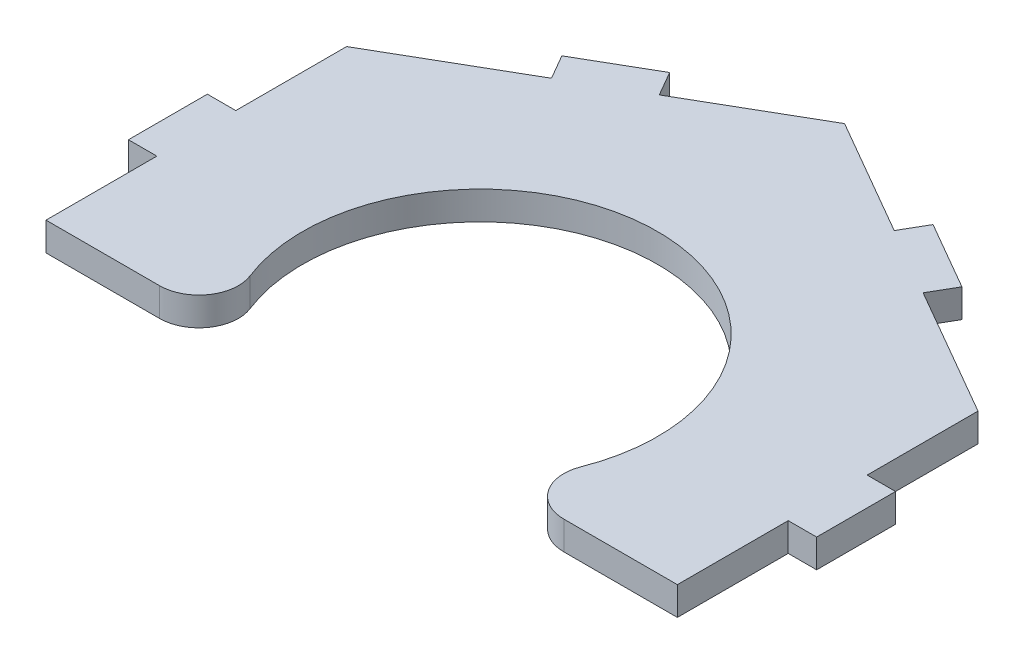
ISO-10303-21;
HEADER;
FILE_DESCRIPTION(('STEP AP214'),'2;1');
FILE_NAME('part.step','',(''),(''),'','','');
FILE_SCHEMA(('AUTOMOTIVE_DESIGN { 1 0 10303 214 1 1 1 1 }'));
ENDSEC;
DATA;
#1=APPLICATION_CONTEXT('core data for automotive mechanical design processes');
#2=APPLICATION_PROTOCOL_DEFINITION('international standard','automotive_design',2000,#1);
#3=PRODUCT_CONTEXT('',#1,'mechanical');
#4=PRODUCT('Part','Part','',(#3));
#5=PRODUCT_RELATED_PRODUCT_CATEGORY('part','',(#4));
#6=PRODUCT_DEFINITION_FORMATION('','',#4);
#7=PRODUCT_DEFINITION_CONTEXT('part definition',#1,'design');
#8=PRODUCT_DEFINITION('design','',#6,#7);
#9=PRODUCT_DEFINITION_SHAPE('','',#8);
#10=(LENGTH_UNIT() NAMED_UNIT(*) SI_UNIT(.MILLI.,.METRE.));
#11=(NAMED_UNIT(*) PLANE_ANGLE_UNIT() SI_UNIT($,.RADIAN.));
#12=(NAMED_UNIT(*) SI_UNIT($,.STERADIAN.) SOLID_ANGLE_UNIT());
#13=UNCERTAINTY_MEASURE_WITH_UNIT(LENGTH_MEASURE(1.E-05),#10,'distance_accuracy_value','');
#14=(GEOMETRIC_REPRESENTATION_CONTEXT(3) GLOBAL_UNCERTAINTY_ASSIGNED_CONTEXT((#13)) GLOBAL_UNIT_ASSIGNED_CONTEXT((#10,
#11,#12)) REPRESENTATION_CONTEXT('',''));
#15=CARTESIAN_POINT('',(0.,0.,0.));
#16=DIRECTION('',(0.,0.,1.));
#17=DIRECTION('',(1.,0.,0.));
#18=AXIS2_PLACEMENT_3D('',#15,#16,#17);
#19=CARTESIAN_POINT('',(50.8,4.572,19.05));
#20=DIRECTION('',(-1.,0.,0.));
#21=DIRECTION('',(0.,0.,1.));
#22=AXIS2_PLACEMENT_3D('',#19,#20,#21);
#23=PLANE('',#22);
#24=DIRECTION('',(0.,1.,0.));
#25=VECTOR('',#24,1.);
#26=CARTESIAN_POINT('',(50.8,0.,-11.4896968374165));
#27=LINE('',#26,#25);
#28=CARTESIAN_POINT('',(50.8,0.,-11.4896968374165));
#29=VERTEX_POINT('',#28);
#30=CARTESIAN_POINT('',(50.8,4.572,-11.4896968374165));
#31=VERTEX_POINT('',#30);
#32=EDGE_CURVE('E214',#29,#31,#27,.T.);
#33=ORIENTED_EDGE('',*,*,#32,.F.);
#34=DIRECTION('',(0.,0.,-1.));
#35=VECTOR('',#34,1.);
#36=CARTESIAN_POINT('',(50.8,0.,19.05));
#37=LINE('',#36,#35);
#38=CARTESIAN_POINT('',(50.8,0.,-29.329393674833));
#39=VERTEX_POINT('',#38);
#40=EDGE_CURVE('E281',#29,#39,#37,.T.);
#41=ORIENTED_EDGE('',*,*,#40,.T.);
#42=DIRECTION('',(0.,-1.,0.));
#43=VECTOR('',#42,1.);
#44=CARTESIAN_POINT('',(50.8,4.572,-29.329393674833));
#45=LINE('',#44,#43);
#46=CARTESIAN_POINT('',(50.8,4.572,-29.329393674833));
#47=VERTEX_POINT('',#46);
#48=EDGE_CURVE('E54',#47,#39,#45,.T.);
#49=ORIENTED_EDGE('',*,*,#48,.F.);
#50=DIRECTION('',(0.,0.,-1.));
#51=VECTOR('',#50,1.);
#52=CARTESIAN_POINT('',(50.8,4.572,19.05));
#53=LINE('',#52,#51);
#54=EDGE_CURVE('E231',#31,#47,#53,.T.);
#55=ORIENTED_EDGE('',*,*,#54,.F.);
#56=EDGE_LOOP('',(#33,#41,#49,#55));
#57=FACE_BOUND('',#56,.T.);
#58=ADVANCED_FACE('F45',(#57),#23,.F.);
#59=CARTESIAN_POINT('',(50.8,4.572,-29.329393674833));
#60=DIRECTION('',(-0.5,0.,0.866025403784439));
#61=DIRECTION('',(0.866025403784439,0.,0.5));
#62=AXIS2_PLACEMENT_3D('',#59,#60,#61);
#63=PLANE('',#62);
#64=DIRECTION('',(-0.866025403784439,0.,-0.5));
#65=VECTOR('',#64,1.);
#66=CARTESIAN_POINT('',(50.8,4.572,-29.329393674833));
#67=LINE('',#66,#65);
#68=CARTESIAN_POINT('',(18.9042843786191,4.572,-47.744393674833));
#69=VERTEX_POINT('',#68);
#70=CARTESIAN_POINT('',(0.,4.572,-58.658787349666));
#71=VERTEX_POINT('',#70);
#72=EDGE_CURVE('E69',#69,#71,#67,.T.);
#73=ORIENTED_EDGE('',*,*,#72,.F.);
#74=DIRECTION('',(0.,1.,0.));
#75=VECTOR('',#74,1.);
#76=CARTESIAN_POINT('',(18.9042843786191,0.,-47.744393674833));
#77=LINE('',#76,#75);
#78=CARTESIAN_POINT('',(18.9042843786191,0.,-47.744393674833));
#79=VERTEX_POINT('',#78);
#80=EDGE_CURVE('E472',#79,#69,#77,.T.);
#81=ORIENTED_EDGE('',*,*,#80,.F.);
#82=DIRECTION('',(-0.866025403784439,0.,-0.5));
#83=VECTOR('',#82,1.);
#84=CARTESIAN_POINT('',(50.8,0.,-29.329393674833));
#85=LINE('',#84,#83);
#86=CARTESIAN_POINT('',(0.,0.,-58.658787349666));
#87=VERTEX_POINT('',#86);
#88=EDGE_CURVE('E287',#79,#87,#85,.T.);
#89=ORIENTED_EDGE('',*,*,#88,.T.);
#90=DIRECTION('',(0.,-1.,0.));
#91=VECTOR('',#90,1.);
#92=CARTESIAN_POINT('',(0.,4.572,-58.658787349666));
#93=LINE('',#92,#91);
#94=EDGE_CURVE('E334',#71,#87,#93,.T.);
#95=ORIENTED_EDGE('',*,*,#94,.F.);
#96=EDGE_LOOP('',(#73,#81,#89,#95));
#97=FACE_BOUND('',#96,.T.);
#98=ADVANCED_FACE('F470',(#97),#63,.F.);
#99=CARTESIAN_POINT('',(0.,4.572,-58.658787349666));
#100=DIRECTION('',(0.5,0.,0.866025403784439));
#101=DIRECTION('',(0.866025403784439,0.,-0.5));
#102=AXIS2_PLACEMENT_3D('',#99,#100,#101);
#103=PLANE('',#102);
#104=DIRECTION('',(-0.866025403784439,0.,0.5));
#105=VECTOR('',#104,1.);
#106=CARTESIAN_POINT('',(0.,4.572,-58.658787349666));
#107=LINE('',#106,#105);
#108=CARTESIAN_POINT('',(-29.9028070066815,4.572,-41.394393674833));
#109=VERTEX_POINT('',#108);
#110=CARTESIAN_POINT('',(-50.8,4.572,-29.329393674833));
#111=VERTEX_POINT('',#110);
#112=EDGE_CURVE('E254',#109,#111,#107,.T.);
#113=ORIENTED_EDGE('',*,*,#112,.F.);
#114=DIRECTION('',(0.,1.,0.));
#115=VECTOR('',#114,1.);
#116=CARTESIAN_POINT('',(-29.9028070066815,0.,-41.394393674833));
#117=LINE('',#116,#115);
#118=CARTESIAN_POINT('',(-29.9028070066815,0.,-41.394393674833));
#119=VERTEX_POINT('',#118);
#120=EDGE_CURVE('E375',#119,#109,#117,.T.);
#121=ORIENTED_EDGE('',*,*,#120,.F.);
#122=DIRECTION('',(-0.866025403784439,0.,0.5));
#123=VECTOR('',#122,1.);
#124=CARTESIAN_POINT('',(0.,0.,-58.658787349666));
#125=LINE('',#124,#123);
#126=CARTESIAN_POINT('',(-50.8,0.,-29.329393674833));
#127=VERTEX_POINT('',#126);
#128=EDGE_CURVE('E291',#119,#127,#125,.T.);
#129=ORIENTED_EDGE('',*,*,#128,.T.);
#130=DIRECTION('',(0.,-1.,0.));
#131=VECTOR('',#130,1.);
#132=CARTESIAN_POINT('',(-50.8,4.572,-29.329393674833));
#133=LINE('',#132,#131);
#134=EDGE_CURVE('E330',#111,#127,#133,.T.);
#135=ORIENTED_EDGE('',*,*,#134,.F.);
#136=EDGE_LOOP('',(#113,#121,#129,#135));
#137=FACE_BOUND('',#136,.T.);
#138=ADVANCED_FACE('F447',(#137),#103,.F.);
#139=CARTESIAN_POINT('',(-50.8,4.572,-29.329393674833));
#140=DIRECTION('',(1.,0.,0.));
#141=DIRECTION('',(0.,0.,-1.));
#142=AXIS2_PLACEMENT_3D('',#139,#140,#141);
#143=PLANE('',#142);
#144=DIRECTION('',(0.,1.,0.));
#145=VECTOR('',#144,1.);
#146=CARTESIAN_POINT('',(-50.8,0.,1.21030316258351));
#147=LINE('',#146,#145);
#148=CARTESIAN_POINT('',(-50.8,0.,1.21030316258351));
#149=VERTEX_POINT('',#148);
#150=CARTESIAN_POINT('',(-50.8,4.572,1.21030316258351));
#151=VERTEX_POINT('',#150);
#152=EDGE_CURVE('E282',#149,#151,#147,.T.);
#153=ORIENTED_EDGE('',*,*,#152,.F.);
#154=DIRECTION('',(0.,0.,1.));
#155=VECTOR('',#154,1.);
#156=CARTESIAN_POINT('',(-50.8,0.,-29.329393674833));
#157=LINE('',#156,#155);
#158=CARTESIAN_POINT('',(-50.8,0.,19.05));
#159=VERTEX_POINT('',#158);
#160=EDGE_CURVE('E295',#149,#159,#157,.T.);
#161=ORIENTED_EDGE('',*,*,#160,.T.);
#162=DIRECTION('',(0.,-1.,0.));
#163=VECTOR('',#162,1.);
#164=CARTESIAN_POINT('',(-50.8,4.572,19.05));
#165=LINE('',#164,#163);
#166=CARTESIAN_POINT('',(-50.8,4.572,19.05));
#167=VERTEX_POINT('',#166);
#168=EDGE_CURVE('E326',#167,#159,#165,.T.);
#169=ORIENTED_EDGE('',*,*,#168,.F.);
#170=DIRECTION('',(0.,0.,1.));
#171=VECTOR('',#170,1.);
#172=CARTESIAN_POINT('',(-50.8,4.572,-29.329393674833));
#173=LINE('',#172,#171);
#174=EDGE_CURVE('E259',#151,#167,#173,.T.);
#175=ORIENTED_EDGE('',*,*,#174,.F.);
#176=EDGE_LOOP('',(#153,#161,#169,#175));
#177=FACE_BOUND('',#176,.T.);
#178=ADVANCED_FACE('F462',(#177),#143,.F.);
#179=CARTESIAN_POINT('',(50.8,4.572,19.05));
#180=DIRECTION('',(0.,0.,-1.));
#181=DIRECTION('',(-1.,0.,0.));
#182=AXIS2_PLACEMENT_3D('',#179,#180,#181);
#183=PLANE('',#182);
#184=DIRECTION('',(1.,0.,0.));
#185=VECTOR('',#184,1.);
#186=CARTESIAN_POINT('',(50.8,0.,19.05));
#187=LINE('',#186,#185);
#188=CARTESIAN_POINT('',(32.5340686819217,0.,19.05));
#189=VERTEX_POINT('',#188);
#190=CARTESIAN_POINT('',(50.8,0.,19.05));
#191=VERTEX_POINT('',#190);
#192=EDGE_CURVE('E277',#189,#191,#187,.T.);
#193=ORIENTED_EDGE('',*,*,#192,.T.);
#194=DIRECTION('',(0.,-1.,0.));
#195=VECTOR('',#194,1.);
#196=CARTESIAN_POINT('',(50.8,4.572,19.05));
#197=LINE('',#196,#195);
#198=CARTESIAN_POINT('',(50.8,4.572,19.05));
#199=VERTEX_POINT('',#198);
#200=EDGE_CURVE('E11',#199,#191,#197,.T.);
#201=ORIENTED_EDGE('',*,*,#200,.F.);
#202=DIRECTION('',(1.,0.,0.));
#203=VECTOR('',#202,1.);
#204=CARTESIAN_POINT('',(50.8,4.572,19.05));
#205=LINE('',#204,#203);
#206=CARTESIAN_POINT('',(32.5340686819217,4.572,19.05));
#207=VERTEX_POINT('',#206);
#208=EDGE_CURVE('E242',#207,#199,#205,.T.);
#209=ORIENTED_EDGE('',*,*,#208,.F.);
#210=DIRECTION('',(0.,-1.,0.));
#211=VECTOR('',#210,1.);
#212=CARTESIAN_POINT('',(32.5340686819217,4.572,19.05));
#213=LINE('',#212,#211);
#214=EDGE_CURVE('E276',#207,#189,#213,.T.);
#215=ORIENTED_EDGE('',*,*,#214,.T.);
#216=EDGE_LOOP('',(#193,#201,#209,#215));
#217=FACE_BOUND('',#216,.T.);
#218=ADVANCED_FACE('F47',(#217),#183,.F.);
#219=CARTESIAN_POINT('',(50.8,0.,1.21030316258351));
#220=VERTEX_POINT('',#219);
#221=EDGE_CURVE('E283',#191,#220,#37,.T.);
#222=ORIENTED_EDGE('',*,*,#221,.T.);
#223=DIRECTION('',(0.,1.,0.));
#224=VECTOR('',#223,1.);
#225=CARTESIAN_POINT('',(50.8,0.,1.21030316258351));
#226=LINE('',#225,#224);
#227=CARTESIAN_POINT('',(50.8,4.572,1.21030316258351));
#228=VERTEX_POINT('',#227);
#229=EDGE_CURVE('E511',#220,#228,#226,.T.);
#230=ORIENTED_EDGE('',*,*,#229,.T.);
#231=EDGE_CURVE('E241',#199,#228,#53,.T.);
#232=ORIENTED_EDGE('',*,*,#231,.F.);
#233=ORIENTED_EDGE('',*,*,#200,.T.);
#234=EDGE_LOOP('',(#222,#230,#232,#233));
#235=FACE_BOUND('',#234,.T.);
#236=ADVANCED_FACE('F510',(#235),#23,.F.);
#237=CARTESIAN_POINT('',(29.9028070066815,0.,-41.394393674833));
#238=VERTEX_POINT('',#237);
#239=EDGE_CURVE('E288',#39,#238,#85,.T.);
#240=ORIENTED_EDGE('',*,*,#239,.T.);
#241=DIRECTION('',(0.,1.,0.));
#242=VECTOR('',#241,1.);
#243=CARTESIAN_POINT('',(29.9028070066815,0.,-41.394393674833));
#244=LINE('',#243,#242);
#245=CARTESIAN_POINT('',(29.9028070066815,4.572,-41.394393674833));
#246=VERTEX_POINT('',#245);
#247=EDGE_CURVE('E534',#238,#246,#244,.T.);
#248=ORIENTED_EDGE('',*,*,#247,.T.);
#249=EDGE_CURVE('E251',#47,#246,#67,.T.);
#250=ORIENTED_EDGE('',*,*,#249,.F.);
#251=ORIENTED_EDGE('',*,*,#48,.T.);
#252=EDGE_LOOP('',(#240,#248,#250,#251));
#253=FACE_BOUND('',#252,.T.);
#254=ADVANCED_FACE('F340',(#253),#63,.F.);
#255=CARTESIAN_POINT('',(-18.9042843786191,0.,-47.744393674833));
#256=VERTEX_POINT('',#255);
#257=EDGE_CURVE('E292',#87,#256,#125,.T.);
#258=ORIENTED_EDGE('',*,*,#257,.T.);
#259=DIRECTION('',(0.,1.,0.));
#260=VECTOR('',#259,1.);
#261=CARTESIAN_POINT('',(-18.9042843786191,0.,-47.744393674833));
#262=LINE('',#261,#260);
#263=CARTESIAN_POINT('',(-18.9042843786191,4.572,-47.744393674833));
#264=VERTEX_POINT('',#263);
#265=EDGE_CURVE('E365',#256,#264,#262,.T.);
#266=ORIENTED_EDGE('',*,*,#265,.T.);
#267=EDGE_CURVE('E255',#71,#264,#107,.T.);
#268=ORIENTED_EDGE('',*,*,#267,.F.);
#269=ORIENTED_EDGE('',*,*,#94,.T.);
#270=EDGE_LOOP('',(#258,#266,#268,#269));
#271=FACE_BOUND('',#270,.T.);
#272=ADVANCED_FACE('F476',(#271),#103,.F.);
#273=CARTESIAN_POINT('',(-50.8,0.,-11.4896968374165));
#274=VERTEX_POINT('',#273);
#275=EDGE_CURVE('E296',#127,#274,#157,.T.);
#276=ORIENTED_EDGE('',*,*,#275,.T.);
#277=DIRECTION('',(0.,1.,0.));
#278=VECTOR('',#277,1.);
#279=CARTESIAN_POINT('',(-50.8,0.,-11.4896968374165));
#280=LINE('',#279,#278);
#281=CARTESIAN_POINT('',(-50.8,4.572,-11.4896968374165));
#282=VERTEX_POINT('',#281);
#283=EDGE_CURVE('E416',#274,#282,#280,.T.);
#284=ORIENTED_EDGE('',*,*,#283,.T.);
#285=EDGE_CURVE('E260',#111,#282,#173,.T.);
#286=ORIENTED_EDGE('',*,*,#285,.F.);
#287=ORIENTED_EDGE('',*,*,#134,.T.);
#288=EDGE_LOOP('',(#276,#284,#286,#287));
#289=FACE_BOUND('',#288,.T.);
#290=ADVANCED_FACE('F438',(#289),#143,.F.);
#291=CARTESIAN_POINT('',(-50.8,4.572,19.05));
#292=DIRECTION('',(0.,0.,-1.));
#293=DIRECTION('',(-1.,0.,0.));
#294=AXIS2_PLACEMENT_3D('',#291,#292,#293);
#295=PLANE('',#294);
#296=DIRECTION('',(1.,0.,0.));
#297=VECTOR('',#296,1.);
#298=CARTESIAN_POINT('',(-50.8,0.,19.05));
#299=LINE('',#298,#297);
#300=CARTESIAN_POINT('',(-32.5340686819217,0.,19.05));
#301=VERTEX_POINT('',#300);
#302=EDGE_CURVE('E300',#159,#301,#299,.T.);
#303=ORIENTED_EDGE('',*,*,#302,.T.);
#304=DIRECTION('',(0.,-1.,0.));
#305=VECTOR('',#304,1.);
#306=CARTESIAN_POINT('',(-32.5340686819217,4.572,19.05));
#307=LINE('',#306,#305);
#308=CARTESIAN_POINT('',(-32.5340686819217,4.572,19.05));
#309=VERTEX_POINT('',#308);
#310=EDGE_CURVE('E322',#309,#301,#307,.T.);
#311=ORIENTED_EDGE('',*,*,#310,.F.);
#312=DIRECTION('',(1.,0.,0.));
#313=VECTOR('',#312,1.);
#314=CARTESIAN_POINT('',(-50.8,4.572,19.05));
#315=LINE('',#314,#313);
#316=EDGE_CURVE('E264',#167,#309,#315,.T.);
#317=ORIENTED_EDGE('',*,*,#316,.F.);
#318=ORIENTED_EDGE('',*,*,#168,.T.);
#319=EDGE_LOOP('',(#303,#311,#317,#318));
#320=FACE_BOUND('',#319,.T.);
#321=ADVANCED_FACE('F491',(#320),#295,.F.);
#322=CARTESIAN_POINT('',(-32.5340686819217,4.572,12.7));
#323=DIRECTION('',(0.,-1.,0.));
#324=DIRECTION('',(0.,0.,-1.));
#325=AXIS2_PLACEMENT_3D('',#322,#323,#324);
#326=CYLINDRICAL_SURFACE('',#325,6.35);
#327=CARTESIAN_POINT('',(-32.5340686819217,0.,12.7));
#328=DIRECTION('',(0.,1.,0.));
#329=DIRECTION('',(0.,0.,1.));
#330=AXIS2_PLACEMENT_3D('',#327,#328,#329);
#331=CIRCLE('',#330,6.35);
#332=CARTESIAN_POINT('',(-26.6187834670269,0.,10.3909090909091));
#333=VERTEX_POINT('',#332);
#334=EDGE_CURVE('E303',#301,#333,#331,.T.);
#335=ORIENTED_EDGE('',*,*,#334,.T.);
#336=DIRECTION('',(0.,-1.,0.));
#337=VECTOR('',#336,1.);
#338=CARTESIAN_POINT('',(-26.6187834670269,4.572,10.3909090909091));
#339=LINE('',#338,#337);
#340=CARTESIAN_POINT('',(-26.6187834670269,4.572,10.3909090909091));
#341=VERTEX_POINT('',#340);
#342=EDGE_CURVE('E318',#341,#333,#339,.T.);
#343=ORIENTED_EDGE('',*,*,#342,.F.);
#344=CARTESIAN_POINT('',(-32.5340686819217,4.572,12.7));
#345=DIRECTION('',(0.,1.,0.));
#346=DIRECTION('',(0.,0.,1.));
#347=AXIS2_PLACEMENT_3D('',#344,#345,#346);
#348=CIRCLE('',#347,6.35);
#349=EDGE_CURVE('E267',#309,#341,#348,.T.);
#350=ORIENTED_EDGE('',*,*,#349,.F.);
#351=ORIENTED_EDGE('',*,*,#310,.T.);
#352=EDGE_LOOP('',(#335,#343,#350,#351));
#353=FACE_BOUND('',#352,.T.);
#354=ADVANCED_FACE('F495',(#353),#326,.T.);
#355=CARTESIAN_POINT('',(0.,4.572,0.));
#356=DIRECTION('',(0.,-1.,0.));
#357=DIRECTION('',(0.,0.,-1.));
#358=AXIS2_PLACEMENT_3D('',#355,#356,#357);
#359=CYLINDRICAL_SURFACE('',#358,28.575);
#360=CARTESIAN_POINT('',(0.,0.,0.));
#361=DIRECTION('',(0.,-1.,0.));
#362=DIRECTION('',(0.,0.,1.));
#363=AXIS2_PLACEMENT_3D('',#360,#361,#362);
#364=CIRCLE('',#363,28.575);
#365=CARTESIAN_POINT('',(26.6187834670269,0.,10.3909090909091));
#366=VERTEX_POINT('',#365);
#367=EDGE_CURVE('E306',#333,#366,#364,.T.);
#368=ORIENTED_EDGE('',*,*,#367,.T.);
#369=DIRECTION('',(0.,-1.,0.));
#370=VECTOR('',#369,1.);
#371=CARTESIAN_POINT('',(26.6187834670269,4.572,10.3909090909091));
#372=LINE('',#371,#370);
#373=CARTESIAN_POINT('',(26.6187834670269,4.572,10.3909090909091));
#374=VERTEX_POINT('',#373);
#375=EDGE_CURVE('E314',#374,#366,#372,.T.);
#376=ORIENTED_EDGE('',*,*,#375,.F.);
#377=CARTESIAN_POINT('',(0.,4.572,0.));
#378=DIRECTION('',(0.,-1.,0.));
#379=DIRECTION('',(0.,0.,1.));
#380=AXIS2_PLACEMENT_3D('',#377,#378,#379);
#381=CIRCLE('',#380,28.575);
#382=EDGE_CURVE('E270',#341,#374,#381,.T.);
#383=ORIENTED_EDGE('',*,*,#382,.F.);
#384=ORIENTED_EDGE('',*,*,#342,.T.);
#385=EDGE_LOOP('',(#368,#376,#383,#384));
#386=FACE_BOUND('',#385,.T.);
#387=ADVANCED_FACE('F501',(#386),#359,.F.);
#388=CARTESIAN_POINT('',(32.5340686819217,4.572,12.7));
#389=DIRECTION('',(0.,-1.,0.));
#390=DIRECTION('',(0.,0.,-1.));
#391=AXIS2_PLACEMENT_3D('',#388,#389,#390);
#392=CYLINDRICAL_SURFACE('',#391,6.35);
#393=CARTESIAN_POINT('',(32.5340686819217,0.,12.7));
#394=DIRECTION('',(0.,1.,0.));
#395=DIRECTION('',(0.,0.,-1.));
#396=AXIS2_PLACEMENT_3D('',#393,#394,#395);
#397=CIRCLE('',#396,6.35);
#398=EDGE_CURVE('E247',#366,#189,#397,.T.);
#399=ORIENTED_EDGE('',*,*,#398,.T.);
#400=ORIENTED_EDGE('',*,*,#214,.F.);
#401=CARTESIAN_POINT('',(32.5340686819217,4.572,12.7));
#402=DIRECTION('',(0.,1.,0.));
#403=DIRECTION('',(0.,0.,-1.));
#404=AXIS2_PLACEMENT_3D('',#401,#402,#403);
#405=CIRCLE('',#404,6.35);
#406=EDGE_CURVE('E273',#374,#207,#405,.T.);
#407=ORIENTED_EDGE('',*,*,#406,.F.);
#408=ORIENTED_EDGE('',*,*,#375,.T.);
#409=EDGE_LOOP('',(#399,#400,#407,#408));
#410=FACE_BOUND('',#409,.T.);
#411=ADVANCED_FACE('F505',(#410),#392,.T.);
#412=CARTESIAN_POINT('',(32.5340686819217,4.572,12.7));
#413=DIRECTION('',(0.,-1.,0.));
#414=DIRECTION('',(0.,0.,-1.));
#415=AXIS2_PLACEMENT_3D('',#412,#413,#414);
#416=PLANE('',#415);
#417=ORIENTED_EDGE('',*,*,#208,.T.);
#418=ORIENTED_EDGE('',*,*,#231,.T.);
#419=DIRECTION('',(1.,0.,0.));
#420=VECTOR('',#419,1.);
#421=CARTESIAN_POINT('',(55.372,4.572,1.21030316258351));
#422=LINE('',#421,#420);
#423=CARTESIAN_POINT('',(55.372,4.572,1.21030316258351));
#424=VERTEX_POINT('',#423);
#425=EDGE_CURVE('E61',#228,#424,#422,.T.);
#426=ORIENTED_EDGE('',*,*,#425,.T.);
#427=DIRECTION('',(0.,0.,-1.));
#428=VECTOR('',#427,1.);
#429=CARTESIAN_POINT('',(55.372,4.572,-11.4896968374165));
#430=LINE('',#429,#428);
#431=CARTESIAN_POINT('',(55.372,4.572,-11.4896968374165));
#432=VERTEX_POINT('',#431);
#433=EDGE_CURVE('E234',#424,#432,#430,.T.);
#434=ORIENTED_EDGE('',*,*,#433,.T.);
#435=DIRECTION('',(-1.,0.,0.));
#436=VECTOR('',#435,1.);
#437=CARTESIAN_POINT('',(50.8,4.572,-11.4896968374165));
#438=LINE('',#437,#436);
#439=EDGE_CURVE('E217',#432,#31,#438,.T.);
#440=ORIENTED_EDGE('',*,*,#439,.T.);
#441=ORIENTED_EDGE('',*,*,#54,.T.);
#442=ORIENTED_EDGE('',*,*,#249,.T.);
#443=DIRECTION('',(0.500000000000002,0.,-0.866025403784438));
#444=VECTOR('',#443,1.);
#445=CARTESIAN_POINT('',(32.1888070066815,4.572,-45.3538618209354));
#446=LINE('',#445,#444);
#447=CARTESIAN_POINT('',(32.1888070066815,4.572,-45.3538618209354));
#448=VERTEX_POINT('',#447);
#449=EDGE_CURVE('E379',#246,#448,#446,.T.);
#450=ORIENTED_EDGE('',*,*,#449,.T.);
#451=DIRECTION('',(-0.866025403784438,0.,-0.5));
#452=VECTOR('',#451,1.);
#453=CARTESIAN_POINT('',(21.1902843786191,4.572,-51.7038618209354));
#454=LINE('',#453,#452);
#455=CARTESIAN_POINT('',(21.1902843786191,4.572,-51.7038618209354));
#456=VERTEX_POINT('',#455);
#457=EDGE_CURVE('E359',#448,#456,#454,.T.);
#458=ORIENTED_EDGE('',*,*,#457,.T.);
#459=DIRECTION('',(-0.5,0.,0.866025403784438));
#460=VECTOR('',#459,1.);
#461=CARTESIAN_POINT('',(18.9042843786191,4.572,-47.744393674833));
#462=LINE('',#461,#460);
#463=EDGE_CURVE('E354',#456,#69,#462,.T.);
#464=ORIENTED_EDGE('',*,*,#463,.T.);
#465=ORIENTED_EDGE('',*,*,#72,.T.);
#466=ORIENTED_EDGE('',*,*,#267,.T.);
#467=DIRECTION('',(-0.5,0.,-0.866025403784438));
#468=VECTOR('',#467,1.);
#469=CARTESIAN_POINT('',(-21.1902843786191,4.572,-51.7038618209354));
#470=LINE('',#469,#468);
#471=CARTESIAN_POINT('',(-21.1902843786191,4.572,-51.7038618209354));
#472=VERTEX_POINT('',#471);
#473=EDGE_CURVE('E389',#264,#472,#470,.T.);
#474=ORIENTED_EDGE('',*,*,#473,.T.);
#475=DIRECTION('',(-0.866025403784439,0.,0.5));
#476=VECTOR('',#475,1.);
#477=CARTESIAN_POINT('',(-32.1888070066815,4.572,-45.3538618209354));
#478=LINE('',#477,#476);
#479=CARTESIAN_POINT('',(-32.1888070066815,4.572,-45.3538618209354));
#480=VERTEX_POINT('',#479);
#481=EDGE_CURVE('E384',#472,#480,#478,.T.);
#482=ORIENTED_EDGE('',*,*,#481,.T.);
#483=DIRECTION('',(0.5,0.,0.866025403784438));
#484=VECTOR('',#483,1.);
#485=CARTESIAN_POINT('',(-29.9028070066815,4.572,-41.394393674833));
#486=LINE('',#485,#484);
#487=EDGE_CURVE('E380',#480,#109,#486,.T.);
#488=ORIENTED_EDGE('',*,*,#487,.T.);
#489=ORIENTED_EDGE('',*,*,#112,.T.);
#490=ORIENTED_EDGE('',*,*,#285,.T.);
#491=DIRECTION('',(-1.,0.,0.));
#492=VECTOR('',#491,1.);
#493=CARTESIAN_POINT('',(-50.8,4.572,-11.4896968374165));
#494=LINE('',#493,#492);
#495=CARTESIAN_POINT('',(-55.372,4.572,-11.4896968374165));
#496=VERTEX_POINT('',#495);
#497=EDGE_CURVE('E393',#282,#496,#494,.T.);
#498=ORIENTED_EDGE('',*,*,#497,.T.);
#499=DIRECTION('',(0.,0.,1.));
#500=VECTOR('',#499,1.);
#501=CARTESIAN_POINT('',(-55.372,4.572,-11.4896968374165));
#502=LINE('',#501,#500);
#503=CARTESIAN_POINT('',(-55.372,4.572,1.21030316258352));
#504=VERTEX_POINT('',#503);
#505=EDGE_CURVE('E420',#496,#504,#502,.T.);
#506=ORIENTED_EDGE('',*,*,#505,.T.);
#507=DIRECTION('',(1.,0.,0.));
#508=VECTOR('',#507,1.);
#509=CARTESIAN_POINT('',(-55.372,4.572,1.21030316258352));
#510=LINE('',#509,#508);
#511=EDGE_CURVE('E409',#504,#151,#510,.T.);
#512=ORIENTED_EDGE('',*,*,#511,.T.);
#513=ORIENTED_EDGE('',*,*,#174,.T.);
#514=ORIENTED_EDGE('',*,*,#316,.T.);
#515=ORIENTED_EDGE('',*,*,#349,.T.);
#516=ORIENTED_EDGE('',*,*,#382,.T.);
#517=ORIENTED_EDGE('',*,*,#406,.T.);
#518=EDGE_LOOP('',(#417,#418,#426,#434,#440,#441,#442,#450,#458,#464,#465,#466,#474,#482,#488,
#489,#490,#498,#506,#512,#513,#514,#515,#516,#517));
#519=FACE_BOUND('',#518,.T.);
#520=ADVANCED_FACE('F229',(#519),#416,.F.);
#521=CARTESIAN_POINT('',(32.5340686819217,0.,12.7));
#522=DIRECTION('',(0.,-1.,0.));
#523=DIRECTION('',(0.,0.,-1.));
#524=AXIS2_PLACEMENT_3D('',#521,#522,#523);
#525=PLANE('',#524);
#526=ORIENTED_EDGE('',*,*,#192,.F.);
#527=ORIENTED_EDGE('',*,*,#398,.F.);
#528=ORIENTED_EDGE('',*,*,#367,.F.);
#529=ORIENTED_EDGE('',*,*,#334,.F.);
#530=ORIENTED_EDGE('',*,*,#302,.F.);
#531=ORIENTED_EDGE('',*,*,#160,.F.);
#532=DIRECTION('',(1.,0.,0.));
#533=VECTOR('',#532,1.);
#534=CARTESIAN_POINT('',(-55.372,0.,1.21030316258352));
#535=LINE('',#534,#533);
#536=CARTESIAN_POINT('',(-55.372,0.,1.21030316258352));
#537=VERTEX_POINT('',#536);
#538=EDGE_CURVE('E413',#537,#149,#535,.T.);
#539=ORIENTED_EDGE('',*,*,#538,.F.);
#540=DIRECTION('',(0.,0.,1.));
#541=VECTOR('',#540,1.);
#542=CARTESIAN_POINT('',(-55.372,0.,-11.4896968374165));
#543=LINE('',#542,#541);
#544=CARTESIAN_POINT('',(-55.372,0.,-11.4896968374165));
#545=VERTEX_POINT('',#544);
#546=EDGE_CURVE('E408',#545,#537,#543,.T.);
#547=ORIENTED_EDGE('',*,*,#546,.F.);
#548=DIRECTION('',(-1.,0.,0.));
#549=VECTOR('',#548,1.);
#550=CARTESIAN_POINT('',(-50.8,0.,-11.4896968374165));
#551=LINE('',#550,#549);
#552=EDGE_CURVE('E404',#274,#545,#551,.T.);
#553=ORIENTED_EDGE('',*,*,#552,.F.);
#554=ORIENTED_EDGE('',*,*,#275,.F.);
#555=ORIENTED_EDGE('',*,*,#128,.F.);
#556=DIRECTION('',(0.5,0.,0.866025403784438));
#557=VECTOR('',#556,1.);
#558=CARTESIAN_POINT('',(-29.9028070066815,0.,-41.394393674833));
#559=LINE('',#558,#557);
#560=CARTESIAN_POINT('',(-32.1888070066815,0.,-45.3538618209354));
#561=VERTEX_POINT('',#560);
#562=EDGE_CURVE('E368',#561,#119,#559,.T.);
#563=ORIENTED_EDGE('',*,*,#562,.F.);
#564=DIRECTION('',(-0.866025403784439,0.,0.5));
#565=VECTOR('',#564,1.);
#566=CARTESIAN_POINT('',(-32.1888070066815,0.,-45.3538618209354));
#567=LINE('',#566,#565);
#568=CARTESIAN_POINT('',(-21.1902843786191,0.,-51.7038618209354));
#569=VERTEX_POINT('',#568);
#570=EDGE_CURVE('E397',#569,#561,#567,.T.);
#571=ORIENTED_EDGE('',*,*,#570,.F.);
#572=DIRECTION('',(-0.5,0.,-0.866025403784438));
#573=VECTOR('',#572,1.);
#574=CARTESIAN_POINT('',(-21.1902843786191,0.,-51.7038618209354));
#575=LINE('',#574,#573);
#576=EDGE_CURVE('E385',#256,#569,#575,.T.);
#577=ORIENTED_EDGE('',*,*,#576,.F.);
#578=ORIENTED_EDGE('',*,*,#257,.F.);
#579=ORIENTED_EDGE('',*,*,#88,.F.);
#580=DIRECTION('',(-0.5,0.,0.866025403784438));
#581=VECTOR('',#580,1.);
#582=CARTESIAN_POINT('',(18.9042843786191,0.,-47.744393674833));
#583=LINE('',#582,#581);
#584=CARTESIAN_POINT('',(21.1902843786191,0.,-51.7038618209354));
#585=VERTEX_POINT('',#584);
#586=EDGE_CURVE('E361',#585,#79,#583,.T.);
#587=ORIENTED_EDGE('',*,*,#586,.F.);
#588=DIRECTION('',(-0.866025403784438,0.,-0.5));
#589=VECTOR('',#588,1.);
#590=CARTESIAN_POINT('',(21.1902843786191,0.,-51.7038618209354));
#591=LINE('',#590,#589);
#592=CARTESIAN_POINT('',(32.1888070066815,0.,-45.3538618209354));
#593=VERTEX_POINT('',#592);
#594=EDGE_CURVE('E351',#593,#585,#591,.T.);
#595=ORIENTED_EDGE('',*,*,#594,.F.);
#596=DIRECTION('',(0.500000000000002,0.,-0.866025403784438));
#597=VECTOR('',#596,1.);
#598=CARTESIAN_POINT('',(32.1888070066815,0.,-45.3538618209354));
#599=LINE('',#598,#597);
#600=EDGE_CURVE('E348',#238,#593,#599,.T.);
#601=ORIENTED_EDGE('',*,*,#600,.F.);
#602=ORIENTED_EDGE('',*,*,#239,.F.);
#603=ORIENTED_EDGE('',*,*,#40,.F.);
#604=DIRECTION('',(-1.,0.,0.));
#605=VECTOR('',#604,1.);
#606=CARTESIAN_POINT('',(50.8,0.,-11.4896968374165));
#607=LINE('',#606,#605);
#608=CARTESIAN_POINT('',(55.372,0.,-11.4896968374165));
#609=VERTEX_POINT('',#608);
#610=EDGE_CURVE('E219',#609,#29,#607,.T.);
#611=ORIENTED_EDGE('',*,*,#610,.F.);
#612=DIRECTION('',(0.,0.,-1.));
#613=VECTOR('',#612,1.);
#614=CARTESIAN_POINT('',(55.372,0.,-11.4896968374165));
#615=LINE('',#614,#613);
#616=CARTESIAN_POINT('',(55.372,0.,1.21030316258351));
#617=VERTEX_POINT('',#616);
#618=EDGE_CURVE('E519',#617,#609,#615,.T.);
#619=ORIENTED_EDGE('',*,*,#618,.F.);
#620=DIRECTION('',(1.,0.,0.));
#621=VECTOR('',#620,1.);
#622=CARTESIAN_POINT('',(55.372,0.,1.21030316258351));
#623=LINE('',#622,#621);
#624=EDGE_CURVE('E236',#220,#617,#623,.T.);
#625=ORIENTED_EDGE('',*,*,#624,.F.);
#626=ORIENTED_EDGE('',*,*,#221,.F.);
#627=EDGE_LOOP('',(#526,#527,#528,#529,#530,#531,#539,#547,#553,#554,#555,#563,#571,#577,#578,
#579,#587,#595,#601,#602,#603,#611,#619,#625,#626));
#628=FACE_BOUND('',#627,.T.);
#629=ADVANCED_FACE('F345',(#628),#525,.T.);
#630=CARTESIAN_POINT('',(-55.372,0.,1.21030316258352));
#631=DIRECTION('',(0.,0.,1.));
#632=DIRECTION('',(1.,0.,0.));
#633=AXIS2_PLACEMENT_3D('',#630,#631,#632);
#634=PLANE('',#633);
#635=ORIENTED_EDGE('',*,*,#511,.F.);
#636=DIRECTION('',(0.,1.,0.));
#637=VECTOR('',#636,1.);
#638=CARTESIAN_POINT('',(-55.372,0.,1.21030316258352));
#639=LINE('',#638,#637);
#640=EDGE_CURVE('E429',#537,#504,#639,.T.);
#641=ORIENTED_EDGE('',*,*,#640,.F.);
#642=ORIENTED_EDGE('',*,*,#538,.T.);
#643=ORIENTED_EDGE('',*,*,#152,.T.);
#644=EDGE_LOOP('',(#635,#641,#642,#643));
#645=FACE_BOUND('',#644,.T.);
#646=ADVANCED_FACE('F458',(#645),#634,.T.);
#647=CARTESIAN_POINT('',(-55.372,0.,-11.4896968374165));
#648=DIRECTION('',(-1.,0.,0.));
#649=DIRECTION('',(0.,0.,1.));
#650=AXIS2_PLACEMENT_3D('',#647,#648,#649);
#651=PLANE('',#650);
#652=ORIENTED_EDGE('',*,*,#505,.F.);
#653=DIRECTION('',(0.,1.,0.));
#654=VECTOR('',#653,1.);
#655=CARTESIAN_POINT('',(-55.372,0.,-11.4896968374165));
#656=LINE('',#655,#654);
#657=EDGE_CURVE('E432',#545,#496,#656,.T.);
#658=ORIENTED_EDGE('',*,*,#657,.F.);
#659=ORIENTED_EDGE('',*,*,#546,.T.);
#660=ORIENTED_EDGE('',*,*,#640,.T.);
#661=EDGE_LOOP('',(#652,#658,#659,#660));
#662=FACE_BOUND('',#661,.T.);
#663=ADVANCED_FACE('F454',(#662),#651,.T.);
#664=CARTESIAN_POINT('',(-50.8,0.,-11.4896968374165));
#665=DIRECTION('',(0.,0.,-1.));
#666=DIRECTION('',(-1.,0.,0.));
#667=AXIS2_PLACEMENT_3D('',#664,#665,#666);
#668=PLANE('',#667);
#669=ORIENTED_EDGE('',*,*,#497,.F.);
#670=ORIENTED_EDGE('',*,*,#283,.F.);
#671=ORIENTED_EDGE('',*,*,#552,.T.);
#672=ORIENTED_EDGE('',*,*,#657,.T.);
#673=EDGE_LOOP('',(#669,#670,#671,#672));
#674=FACE_BOUND('',#673,.T.);
#675=ADVANCED_FACE('F451',(#674),#668,.T.);
#676=CARTESIAN_POINT('',(-29.9028070066815,0.,-41.394393674833));
#677=DIRECTION('',(-0.866025403784438,0.,0.5));
#678=DIRECTION('',(0.5,0.,0.866025403784439));
#679=AXIS2_PLACEMENT_3D('',#676,#677,#678);
#680=PLANE('',#679);
#681=ORIENTED_EDGE('',*,*,#487,.F.);
#682=DIRECTION('',(0.,1.,0.));
#683=VECTOR('',#682,1.);
#684=CARTESIAN_POINT('',(-32.1888070066815,0.,-45.3538618209354));
#685=LINE('',#684,#683);
#686=EDGE_CURVE('E372',#561,#480,#685,.T.);
#687=ORIENTED_EDGE('',*,*,#686,.F.);
#688=ORIENTED_EDGE('',*,*,#562,.T.);
#689=ORIENTED_EDGE('',*,*,#120,.T.);
#690=EDGE_LOOP('',(#681,#687,#688,#689));
#691=FACE_BOUND('',#690,.T.);
#692=ADVANCED_FACE('F696',(#691),#680,.T.);
#693=CARTESIAN_POINT('',(-32.1888070066815,0.,-45.3538618209354));
#694=DIRECTION('',(-0.5,0.,-0.866025403784439));
#695=DIRECTION('',(-0.866025403784439,0.,0.5));
#696=AXIS2_PLACEMENT_3D('',#693,#694,#695);
#697=PLANE('',#696);
#698=ORIENTED_EDGE('',*,*,#481,.F.);
#699=DIRECTION('',(0.,1.,0.));
#700=VECTOR('',#699,1.);
#701=CARTESIAN_POINT('',(-21.1902843786191,0.,-51.7038618209354));
#702=LINE('',#701,#700);
#703=EDGE_CURVE('E369',#569,#472,#702,.T.);
#704=ORIENTED_EDGE('',*,*,#703,.F.);
#705=ORIENTED_EDGE('',*,*,#570,.T.);
#706=ORIENTED_EDGE('',*,*,#686,.T.);
#707=EDGE_LOOP('',(#698,#704,#705,#706));
#708=FACE_BOUND('',#707,.T.);
#709=ADVANCED_FACE('F704',(#708),#697,.T.);
#710=CARTESIAN_POINT('',(-21.1902843786191,0.,-51.7038618209354));
#711=DIRECTION('',(0.866025403784438,0.,-0.5));
#712=DIRECTION('',(-0.5,0.,-0.866025403784439));
#713=AXIS2_PLACEMENT_3D('',#710,#711,#712);
#714=PLANE('',#713);
#715=ORIENTED_EDGE('',*,*,#473,.F.);
#716=ORIENTED_EDGE('',*,*,#265,.F.);
#717=ORIENTED_EDGE('',*,*,#576,.T.);
#718=ORIENTED_EDGE('',*,*,#703,.T.);
#719=EDGE_LOOP('',(#715,#716,#717,#718));
#720=FACE_BOUND('',#719,.T.);
#721=ADVANCED_FACE('F482',(#720),#714,.T.);
#722=CARTESIAN_POINT('',(18.9042843786191,0.,-47.744393674833));
#723=DIRECTION('',(-0.866025403784438,0.,-0.5));
#724=DIRECTION('',(-0.5,0.,0.866025403784439));
#725=AXIS2_PLACEMENT_3D('',#722,#723,#724);
#726=PLANE('',#725);
#727=ORIENTED_EDGE('',*,*,#463,.F.);
#728=DIRECTION('',(0.,1.,0.));
#729=VECTOR('',#728,1.);
#730=CARTESIAN_POINT('',(21.1902843786191,0.,-51.7038618209354));
#731=LINE('',#730,#729);
#732=EDGE_CURVE('E540',#585,#456,#731,.T.);
#733=ORIENTED_EDGE('',*,*,#732,.F.);
#734=ORIENTED_EDGE('',*,*,#586,.T.);
#735=ORIENTED_EDGE('',*,*,#80,.T.);
#736=EDGE_LOOP('',(#727,#733,#734,#735));
#737=FACE_BOUND('',#736,.T.);
#738=ADVANCED_FACE('F551',(#737),#726,.T.);
#739=CARTESIAN_POINT('',(21.1902843786191,0.,-51.7038618209354));
#740=DIRECTION('',(0.5,0.,-0.866025403784438));
#741=DIRECTION('',(-0.866025403784438,0.,-0.5));
#742=AXIS2_PLACEMENT_3D('',#739,#740,#741);
#743=PLANE('',#742);
#744=ORIENTED_EDGE('',*,*,#457,.F.);
#745=DIRECTION('',(0.,1.,0.));
#746=VECTOR('',#745,1.);
#747=CARTESIAN_POINT('',(32.1888070066815,0.,-45.3538618209354));
#748=LINE('',#747,#746);
#749=EDGE_CURVE('E537',#593,#448,#748,.T.);
#750=ORIENTED_EDGE('',*,*,#749,.F.);
#751=ORIENTED_EDGE('',*,*,#594,.T.);
#752=ORIENTED_EDGE('',*,*,#732,.T.);
#753=EDGE_LOOP('',(#744,#750,#751,#752));
#754=FACE_BOUND('',#753,.T.);
#755=ADVANCED_FACE('F554',(#754),#743,.T.);
#756=CARTESIAN_POINT('',(32.1888070066815,0.,-45.3538618209354));
#757=DIRECTION('',(0.866025403784438,0.,0.500000000000001));
#758=DIRECTION('',(0.500000000000001,0.,-0.866025403784438));
#759=AXIS2_PLACEMENT_3D('',#756,#757,#758);
#760=PLANE('',#759);
#761=ORIENTED_EDGE('',*,*,#449,.F.);
#762=ORIENTED_EDGE('',*,*,#247,.F.);
#763=ORIENTED_EDGE('',*,*,#600,.T.);
#764=ORIENTED_EDGE('',*,*,#749,.T.);
#765=EDGE_LOOP('',(#761,#762,#763,#764));
#766=FACE_BOUND('',#765,.T.);
#767=ADVANCED_FACE('F556',(#766),#760,.T.);
#768=CARTESIAN_POINT('',(50.8,0.,-11.4896968374165));
#769=DIRECTION('',(0.,0.,-1.));
#770=DIRECTION('',(-1.,0.,0.));
#771=AXIS2_PLACEMENT_3D('',#768,#769,#770);
#772=PLANE('',#771);
#773=ORIENTED_EDGE('',*,*,#439,.F.);
#774=DIRECTION('',(0.,1.,0.));
#775=VECTOR('',#774,1.);
#776=CARTESIAN_POINT('',(55.372,0.,-11.4896968374165));
#777=LINE('',#776,#775);
#778=EDGE_CURVE('E224',#609,#432,#777,.T.);
#779=ORIENTED_EDGE('',*,*,#778,.F.);
#780=ORIENTED_EDGE('',*,*,#610,.T.);
#781=ORIENTED_EDGE('',*,*,#32,.T.);
#782=EDGE_LOOP('',(#773,#779,#780,#781));
#783=FACE_BOUND('',#782,.T.);
#784=ADVANCED_FACE('F216',(#783),#772,.T.);
#785=CARTESIAN_POINT('',(55.372,0.,-11.4896968374165));
#786=DIRECTION('',(1.,0.,0.));
#787=DIRECTION('',(0.,0.,-1.));
#788=AXIS2_PLACEMENT_3D('',#785,#786,#787);
#789=PLANE('',#788);
#790=ORIENTED_EDGE('',*,*,#433,.F.);
#791=DIRECTION('',(0.,1.,0.));
#792=VECTOR('',#791,1.);
#793=CARTESIAN_POINT('',(55.372,0.,1.21030316258351));
#794=LINE('',#793,#792);
#795=EDGE_CURVE('E515',#617,#424,#794,.T.);
#796=ORIENTED_EDGE('',*,*,#795,.F.);
#797=ORIENTED_EDGE('',*,*,#618,.T.);
#798=ORIENTED_EDGE('',*,*,#778,.T.);
#799=EDGE_LOOP('',(#790,#796,#797,#798));
#800=FACE_BOUND('',#799,.T.);
#801=ADVANCED_FACE('F563',(#800),#789,.T.);
#802=CARTESIAN_POINT('',(55.372,0.,1.21030316258351));
#803=DIRECTION('',(0.,0.,1.));
#804=DIRECTION('',(1.,0.,0.));
#805=AXIS2_PLACEMENT_3D('',#802,#803,#804);
#806=PLANE('',#805);
#807=ORIENTED_EDGE('',*,*,#425,.F.);
#808=ORIENTED_EDGE('',*,*,#229,.F.);
#809=ORIENTED_EDGE('',*,*,#624,.T.);
#810=ORIENTED_EDGE('',*,*,#795,.T.);
#811=EDGE_LOOP('',(#807,#808,#809,#810));
#812=FACE_BOUND('',#811,.T.);
#813=ADVANCED_FACE('F749',(#812),#806,.T.);
#814=CLOSED_SHELL('',(#58,#98,#138,#178,#218,#236,#254,#272,#290,#321,#354,#387,#411,#520,#629,
#646,#663,#675,#692,#709,#721,#738,#755,#767,#784,#801,#813));
#815=MANIFOLD_SOLID_BREP('B2',#814);
#816=ADVANCED_BREP_SHAPE_REPRESENTATION('',(#18,#815),#14);
#817=SHAPE_DEFINITION_REPRESENTATION(#9,#816);
ENDSEC;
END-ISO-10303-21;
